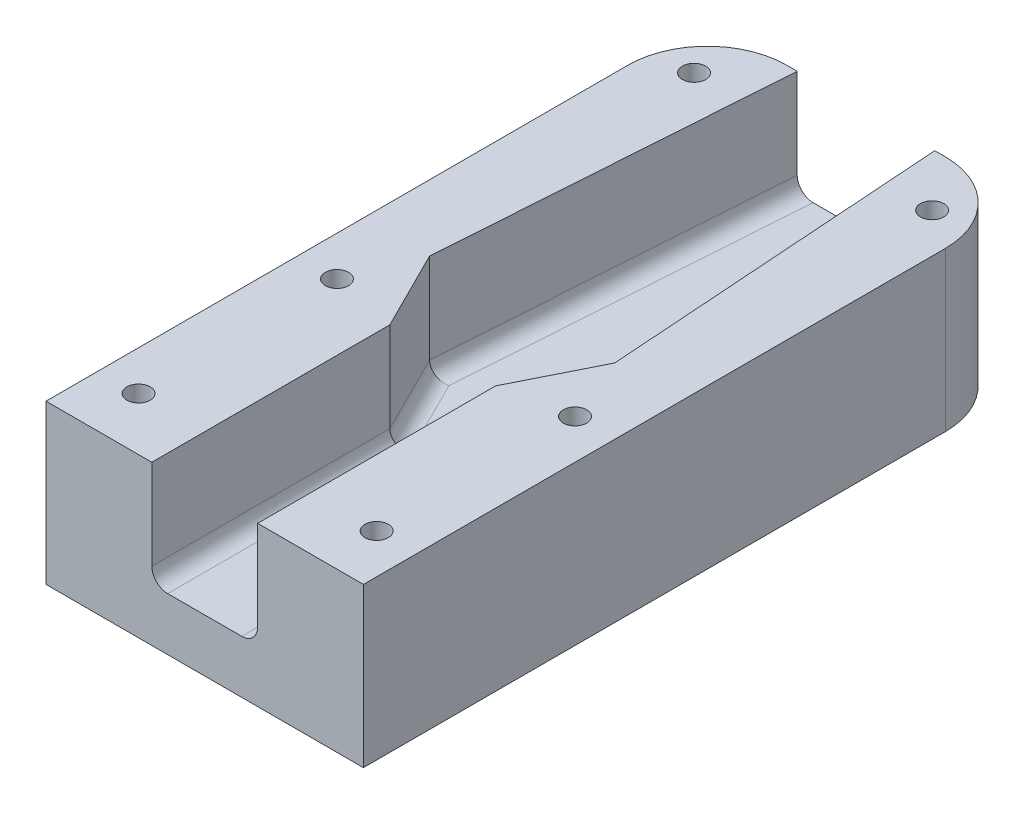
ISO-10303-21;
HEADER;
FILE_DESCRIPTION(('STEP AP214'),'2;1');
FILE_NAME('part.step','',(''),(''),'','','');
FILE_SCHEMA(('AUTOMOTIVE_DESIGN { 1 0 10303 214 1 1 1 1 }'));
ENDSEC;
DATA;
#1=APPLICATION_CONTEXT('core data for automotive mechanical design processes');
#2=APPLICATION_PROTOCOL_DEFINITION('international standard','automotive_design',2000,#1);
#3=PRODUCT_CONTEXT('',#1,'mechanical');
#4=PRODUCT('Part','Part','',(#3));
#5=PRODUCT_RELATED_PRODUCT_CATEGORY('part','',(#4));
#6=PRODUCT_DEFINITION_FORMATION('','',#4);
#7=PRODUCT_DEFINITION_CONTEXT('part definition',#1,'design');
#8=PRODUCT_DEFINITION('design','',#6,#7);
#9=PRODUCT_DEFINITION_SHAPE('','',#8);
#10=(LENGTH_UNIT() NAMED_UNIT(*) SI_UNIT(.MILLI.,.METRE.));
#11=(NAMED_UNIT(*) PLANE_ANGLE_UNIT() SI_UNIT($,.RADIAN.));
#12=(NAMED_UNIT(*) SI_UNIT($,.STERADIAN.) SOLID_ANGLE_UNIT());
#13=UNCERTAINTY_MEASURE_WITH_UNIT(LENGTH_MEASURE(1.E-05),#10,'distance_accuracy_value','');
#14=(GEOMETRIC_REPRESENTATION_CONTEXT(3) GLOBAL_UNCERTAINTY_ASSIGNED_CONTEXT((#13)) GLOBAL_UNIT_ASSIGNED_CONTEXT((#10,
#11,#12)) REPRESENTATION_CONTEXT('',''));
#15=CARTESIAN_POINT('',(0.,0.,0.));
#16=DIRECTION('',(0.,0.,1.));
#17=DIRECTION('',(1.,0.,0.));
#18=AXIS2_PLACEMENT_3D('',#15,#16,#17);
#19=CARTESIAN_POINT('',(-22.5000000000007,0.,52.5000000000062));
#20=DIRECTION('',(0.,1.,0.));
#21=DIRECTION('',(0.,0.,1.));
#22=AXIS2_PLACEMENT_3D('',#19,#20,#21);
#23=CYLINDRICAL_SURFACE('',#22,2.2);
#24=CARTESIAN_POINT('',(-22.5000000000007,30.0000000000002,52.5000000000062));
#25=DIRECTION('',(0.,1.,0.));
#26=DIRECTION('',(0.,0.,1.00000000000006));
#27=AXIS2_PLACEMENT_3D('',#24,#25,#26);
#28=CIRCLE('',#27,2.2);
#29=CARTESIAN_POINT('',(-22.5000000000007,30.0000000000002,54.7000000000063));
#30=VERTEX_POINT('',#29);
#31=EDGE_CURVE('E231',#30,#30,#28,.T.);
#32=ORIENTED_EDGE('',*,*,#31,.T.);
#33=EDGE_LOOP('',(#32));
#34=FACE_BOUND('',#33,.T.);
#35=CARTESIAN_POINT('',(-22.5000000000007,20.,52.5000000000062));
#36=DIRECTION('',(0.,-1.,0.));
#37=DIRECTION('',(0.,0.,-1.));
#38=AXIS2_PLACEMENT_3D('',#35,#36,#37);
#39=CIRCLE('',#38,2.2);
#40=CARTESIAN_POINT('',(-22.5000000000007,20.,50.3000000000062));
#41=VERTEX_POINT('',#40);
#42=EDGE_CURVE('E40',#41,#41,#39,.F.);
#43=ORIENTED_EDGE('',*,*,#42,.F.);
#44=EDGE_LOOP('',(#43));
#45=FACE_BOUND('',#44,.T.);
#46=ADVANCED_FACE('F36',(#34,#45),#23,.F.);
#47=CARTESIAN_POINT('',(22.5,-3.05311331771918E-13,-52.4999999999999));
#48=DIRECTION('',(0.,1.,0.));
#49=DIRECTION('',(0.,0.,1.));
#50=AXIS2_PLACEMENT_3D('',#47,#48,#49);
#51=CYLINDRICAL_SURFACE('',#50,2.2);
#52=CARTESIAN_POINT('',(22.5,29.9999999999999,-52.4999999999999));
#53=DIRECTION('',(0.,1.00000000000002,1.04111164134224E-13));
#54=DIRECTION('',(0.,1.03445030319449E-13,1.00000000000043));
#55=AXIS2_PLACEMENT_3D('',#52,#53,#54);
#56=CIRCLE('',#55,2.2);
#57=CARTESIAN_POINT('',(22.4999999999999,30.0000000000001,-50.299999999999));
#58=VERTEX_POINT('',#57);
#59=EDGE_CURVE('E222',#58,#58,#56,.T.);
#60=ORIENTED_EDGE('',*,*,#59,.T.);
#61=EDGE_LOOP('',(#60));
#62=FACE_BOUND('',#61,.T.);
#63=CARTESIAN_POINT('',(22.5,20.,-52.4999999999999));
#64=DIRECTION('',(0.,-1.,0.));
#65=DIRECTION('',(0.,0.,-1.));
#66=AXIS2_PLACEMENT_3D('',#63,#64,#65);
#67=CIRCLE('',#66,2.2);
#68=CARTESIAN_POINT('',(22.5,20.,-54.6999999999999));
#69=VERTEX_POINT('',#68);
#70=EDGE_CURVE('E327',#69,#69,#67,.F.);
#71=ORIENTED_EDGE('',*,*,#70,.F.);
#72=EDGE_LOOP('',(#71));
#73=FACE_BOUND('',#72,.T.);
#74=ADVANCED_FACE('F337',(#62,#73),#51,.F.);
#75=CARTESIAN_POINT('',(-22.5,-1.94289029309402E-13,-52.5));
#76=DIRECTION('',(0.,1.,0.));
#77=DIRECTION('',(0.,0.,1.));
#78=AXIS2_PLACEMENT_3D('',#75,#76,#77);
#79=CYLINDRICAL_SURFACE('',#78,2.2);
#80=CARTESIAN_POINT('',(-22.5,30.,-52.5));
#81=DIRECTION('',(0.,1.00000000000001,0.));
#82=DIRECTION('',(0.,0.,1.00000000000028));
#83=AXIS2_PLACEMENT_3D('',#80,#81,#82);
#84=CIRCLE('',#83,2.2);
#85=CARTESIAN_POINT('',(-22.5000000000001,30.0000000000001,-50.2999999999994));
#86=VERTEX_POINT('',#85);
#87=EDGE_CURVE('E227',#86,#86,#84,.T.);
#88=ORIENTED_EDGE('',*,*,#87,.T.);
#89=EDGE_LOOP('',(#88));
#90=FACE_BOUND('',#89,.T.);
#91=CARTESIAN_POINT('',(-22.5,20.,-52.5));
#92=DIRECTION('',(0.,-1.,0.));
#93=DIRECTION('',(0.,0.,-1.));
#94=AXIS2_PLACEMENT_3D('',#91,#92,#93);
#95=CIRCLE('',#94,2.2);
#96=CARTESIAN_POINT('',(-22.5,20.,-54.7));
#97=VERTEX_POINT('',#96);
#98=EDGE_CURVE('E325',#97,#97,#95,.F.);
#99=ORIENTED_EDGE('',*,*,#98,.F.);
#100=EDGE_LOOP('',(#99));
#101=FACE_BOUND('',#100,.T.);
#102=ADVANCED_FACE('F343',(#90,#101),#79,.F.);
#103=CARTESIAN_POINT('',(22.4999999999998,-2.4980018054066E-13,52.5000000000009));
#104=DIRECTION('',(0.,1.,0.));
#105=DIRECTION('',(0.,0.,1.));
#106=AXIS2_PLACEMENT_3D('',#103,#104,#105);
#107=CYLINDRICAL_SURFACE('',#106,2.2);
#108=CARTESIAN_POINT('',(22.4999999999998,29.9999999999999,52.5000000000009));
#109=DIRECTION('',(0.,1.00000000000001,0.));
#110=DIRECTION('',(0.,0.,1.00000000000016));
#111=AXIS2_PLACEMENT_3D('',#108,#109,#110);
#112=CIRCLE('',#111,2.2);
#113=CARTESIAN_POINT('',(22.4999999999998,30.,54.7000000000012));
#114=VERTEX_POINT('',#113);
#115=EDGE_CURVE('E228',#114,#114,#112,.T.);
#116=ORIENTED_EDGE('',*,*,#115,.T.);
#117=EDGE_LOOP('',(#116));
#118=FACE_BOUND('',#117,.T.);
#119=CARTESIAN_POINT('',(22.4999999999998,20.,52.5000000000009));
#120=DIRECTION('',(0.,-1.,0.));
#121=DIRECTION('',(0.,0.,-1.));
#122=AXIS2_PLACEMENT_3D('',#119,#120,#121);
#123=CIRCLE('',#122,2.2);
#124=CARTESIAN_POINT('',(22.4999999999998,20.,50.3000000000009));
#125=VERTEX_POINT('',#124);
#126=EDGE_CURVE('E322',#125,#125,#123,.F.);
#127=ORIENTED_EDGE('',*,*,#126,.F.);
#128=EDGE_LOOP('',(#127));
#129=FACE_BOUND('',#128,.T.);
#130=ADVANCED_FACE('F521',(#118,#129),#107,.F.);
#131=CARTESIAN_POINT('',(-22.5,30.0000000000002,15.0000000000009));
#132=DIRECTION('',(0.,-1.,0.));
#133=DIRECTION('',(0.,0.,-1.));
#134=AXIS2_PLACEMENT_3D('',#131,#132,#133);
#135=CYLINDRICAL_SURFACE('',#134,2.2);
#136=CARTESIAN_POINT('',(-22.5,30.0000000000002,15.0000000000009));
#137=DIRECTION('',(0.,-1.00000000000001,0.));
#138=DIRECTION('',(0.,0.,-1.00000000000022));
#139=AXIS2_PLACEMENT_3D('',#136,#137,#138);
#140=CIRCLE('',#139,2.2);
#141=CARTESIAN_POINT('',(-22.5,30.0000000000001,12.8000000000004));
#142=VERTEX_POINT('',#141);
#143=EDGE_CURVE('E207',#142,#142,#140,.T.);
#144=ORIENTED_EDGE('',*,*,#143,.F.);
#145=EDGE_LOOP('',(#144));
#146=FACE_BOUND('',#145,.T.);
#147=CARTESIAN_POINT('',(-22.5,20.,15.0000000000009));
#148=DIRECTION('',(0.,-1.,0.));
#149=DIRECTION('',(0.,0.,-1.));
#150=AXIS2_PLACEMENT_3D('',#147,#148,#149);
#151=CIRCLE('',#150,2.2);
#152=CARTESIAN_POINT('',(-22.5,20.,12.8000000000009));
#153=VERTEX_POINT('',#152);
#154=EDGE_CURVE('E318',#153,#153,#151,.F.);
#155=ORIENTED_EDGE('',*,*,#154,.F.);
#156=EDGE_LOOP('',(#155));
#157=FACE_BOUND('',#156,.T.);
#158=ADVANCED_FACE('F518',(#146,#157),#135,.F.);
#159=CARTESIAN_POINT('',(22.5,30.0000000000002,15.0000000000009));
#160=DIRECTION('',(0.,-1.,0.));
#161=DIRECTION('',(0.,0.,-1.));
#162=AXIS2_PLACEMENT_3D('',#159,#160,#161);
#163=CYLINDRICAL_SURFACE('',#162,2.2);
#164=CARTESIAN_POINT('',(22.5,30.0000000000002,15.0000000000009));
#165=DIRECTION('',(0.,-1.,0.));
#166=DIRECTION('',(0.,0.,-1.00000000000002));
#167=AXIS2_PLACEMENT_3D('',#164,#165,#166);
#168=CIRCLE('',#167,2.2);
#169=CARTESIAN_POINT('',(22.5,30.0000000000002,12.8000000000009));
#170=VERTEX_POINT('',#169);
#171=EDGE_CURVE('E219',#170,#170,#168,.T.);
#172=ORIENTED_EDGE('',*,*,#171,.F.);
#173=EDGE_LOOP('',(#172));
#174=FACE_BOUND('',#173,.T.);
#175=CARTESIAN_POINT('',(22.5,20.,15.0000000000009));
#176=DIRECTION('',(0.,-1.,0.));
#177=DIRECTION('',(0.,0.,-1.));
#178=AXIS2_PLACEMENT_3D('',#175,#176,#177);
#179=CIRCLE('',#178,2.2);
#180=CARTESIAN_POINT('',(22.5,20.,12.8000000000009));
#181=VERTEX_POINT('',#180);
#182=EDGE_CURVE('E315',#181,#181,#179,.F.);
#183=ORIENTED_EDGE('',*,*,#182,.F.);
#184=EDGE_LOOP('',(#183));
#185=FACE_BOUND('',#184,.T.);
#186=ADVANCED_FACE('F370',(#174,#185),#163,.F.);
#187=CARTESIAN_POINT('',(-30.,30.,-62.5));
#188=DIRECTION('',(0.,0.,1.));
#189=DIRECTION('',(1.,0.,0.));
#190=AXIS2_PLACEMENT_3D('',#187,#188,#189);
#191=PLANE('',#190);
#192=DIRECTION('',(-1.,0.,0.));
#193=VECTOR('',#192,1.);
#194=CARTESIAN_POINT('',(-30.,0.,-62.5));
#195=LINE('',#194,#193);
#196=CARTESIAN_POINT('',(15.,0.,-62.5));
#197=VERTEX_POINT('',#196);
#198=CARTESIAN_POINT('',(-15.,0.,-62.5));
#199=VERTEX_POINT('',#198);
#200=EDGE_CURVE('E250',#197,#199,#195,.T.);
#201=ORIENTED_EDGE('',*,*,#200,.T.);
#202=DIRECTION('',(0.,-1.,0.));
#203=VECTOR('',#202,1.);
#204=CARTESIAN_POINT('',(-15.,30.,-62.5));
#205=LINE('',#204,#203);
#206=CARTESIAN_POINT('',(-15.,30.,-62.5));
#207=VERTEX_POINT('',#206);
#208=EDGE_CURVE('E60',#199,#207,#205,.F.);
#209=ORIENTED_EDGE('',*,*,#208,.T.);
#210=DIRECTION('',(-1.,0.,0.));
#211=VECTOR('',#210,1.);
#212=CARTESIAN_POINT('',(-30.,30.,-62.5));
#213=LINE('',#212,#211);
#214=CARTESIAN_POINT('',(-12.9999999999998,30.,-62.5));
#215=VERTEX_POINT('',#214);
#216=EDGE_CURVE('E239',#215,#207,#213,.T.);
#217=ORIENTED_EDGE('',*,*,#216,.F.);
#218=DIRECTION('',(0.,1.,0.));
#219=VECTOR('',#218,1.);
#220=CARTESIAN_POINT('',(-13.,9.99999999999994,-62.4999999999999));
#221=LINE('',#220,#219);
#222=CARTESIAN_POINT('',(-13.,13.0000000000001,-62.4999999999999));
#223=VERTEX_POINT('',#222);
#224=EDGE_CURVE('E177',#223,#215,#221,.T.);
#225=ORIENTED_EDGE('',*,*,#224,.F.);
#226=CARTESIAN_POINT('',(-9.99281924476169,13.0000000000001,-62.5));
#227=DIRECTION('',(0.,0.,1.));
#228=DIRECTION('',(-1.,0.,0.));
#229=AXIS2_PLACEMENT_3D('',#226,#227,#228);
#230=ELLIPSE('',#229,3.00718075523813,3.);
#231=CARTESIAN_POINT('',(-9.99281924476168,9.99999999999991,-62.4999999999997));
#232=VERTEX_POINT('',#231);
#233=EDGE_CURVE('E290',#223,#232,#230,.T.);
#234=ORIENTED_EDGE('',*,*,#233,.T.);
#235=DIRECTION('',(-0.999999999999998,0.,0.));
#236=VECTOR('',#235,1.);
#237=CARTESIAN_POINT('',(0.,9.99999999999994,-62.4999999999998));
#238=LINE('',#237,#236);
#239=CARTESIAN_POINT('',(9.99281924476263,9.99999999999998,-62.4999999999999));
#240=VERTEX_POINT('',#239);
#241=EDGE_CURVE('E203',#240,#232,#238,.T.);
#242=ORIENTED_EDGE('',*,*,#241,.F.);
#243=CARTESIAN_POINT('',(9.99281924476265,13.0000000000001,-62.5));
#244=DIRECTION('',(0.,0.,1.));
#245=DIRECTION('',(-1.,0.,0.));
#246=AXIS2_PLACEMENT_3D('',#243,#244,#245);
#247=ELLIPSE('',#246,3.00718075523813,3.);
#248=CARTESIAN_POINT('',(13.,13.0000000000001,-62.5));
#249=VERTEX_POINT('',#248);
#250=EDGE_CURVE('E284',#240,#249,#247,.T.);
#251=ORIENTED_EDGE('',*,*,#250,.T.);
#252=DIRECTION('',(0.,1.,0.));
#253=VECTOR('',#252,1.);
#254=CARTESIAN_POINT('',(13.,9.99999999999994,-62.5));
#255=LINE('',#254,#253);
#256=CARTESIAN_POINT('',(13.,29.9999999999999,-62.5));
#257=VERTEX_POINT('',#256);
#258=EDGE_CURVE('E204',#249,#257,#255,.T.);
#259=ORIENTED_EDGE('',*,*,#258,.T.);
#260=CARTESIAN_POINT('',(15.,30.,-62.5));
#261=VERTEX_POINT('',#260);
#262=EDGE_CURVE('E241',#261,#257,#213,.T.);
#263=ORIENTED_EDGE('',*,*,#262,.F.);
#264=DIRECTION('',(0.,-1.,0.));
#265=VECTOR('',#264,1.);
#266=CARTESIAN_POINT('',(15.,30.,-62.5));
#267=LINE('',#266,#265);
#268=EDGE_CURVE('E308',#261,#197,#267,.T.);
#269=ORIENTED_EDGE('',*,*,#268,.T.);
#270=EDGE_LOOP('',(#201,#209,#217,#225,#234,#242,#251,#259,#263,#269));
#271=FACE_BOUND('',#270,.T.);
#272=ADVANCED_FACE('F352',(#271),#191,.F.);
#273=CARTESIAN_POINT('',(0.,30.,0.));
#274=DIRECTION('',(0.,1.,0.));
#275=DIRECTION('',(0.,0.,1.));
#276=AXIS2_PLACEMENT_3D('',#273,#274,#275);
#277=PLANE('',#276);
#278=ORIENTED_EDGE('',*,*,#171,.T.);
#279=EDGE_LOOP('',(#278));
#280=FACE_BOUND('',#279,.T.);
#281=ORIENTED_EDGE('',*,*,#115,.F.);
#282=EDGE_LOOP('',(#281));
#283=FACE_BOUND('',#282,.T.);
#284=ORIENTED_EDGE('',*,*,#59,.F.);
#285=EDGE_LOOP('',(#284));
#286=FACE_BOUND('',#285,.T.);
#287=DIRECTION('',(0.,0.,-1.));
#288=VECTOR('',#287,1.);
#289=CARTESIAN_POINT('',(30.,30.,-62.5));
#290=LINE('',#289,#288);
#291=CARTESIAN_POINT('',(30.,30.,62.5));
#292=VERTEX_POINT('',#291);
#293=CARTESIAN_POINT('',(30.,30.,-47.5));
#294=VERTEX_POINT('',#293);
#295=EDGE_CURVE('E237',#292,#294,#290,.T.);
#296=ORIENTED_EDGE('',*,*,#295,.T.);
#297=CARTESIAN_POINT('',(15.,30.,-47.5));
#298=DIRECTION('',(0.,1.,0.));
#299=DIRECTION('',(0.,0.,1.));
#300=AXIS2_PLACEMENT_3D('',#297,#298,#299);
#301=CIRCLE('',#300,15.);
#302=EDGE_CURVE('E11',#294,#261,#301,.T.);
#303=ORIENTED_EDGE('',*,*,#302,.T.);
#304=ORIENTED_EDGE('',*,*,#262,.T.);
#305=DIRECTION('',(0.0690654551877237,0.,0.997612130489518));
#306=VECTOR('',#305,1.);
#307=CARTESIAN_POINT('',(17.2442730110123,29.9999999999999,-1.19383428537767));
#308=LINE('',#307,#306);
#309=CARTESIAN_POINT('',(17.5,30.,2.50000000000028));
#310=VERTEX_POINT('',#309);
#311=EDGE_CURVE('E200',#257,#310,#308,.T.);
#312=ORIENTED_EDGE('',*,*,#311,.T.);
#313=DIRECTION('',(-0.447213595499959,0.,0.89442719099992));
#314=VECTOR('',#313,1.);
#315=CARTESIAN_POINT('',(15.,30.,7.50000000000006));
#316=LINE('',#315,#314);
#317=CARTESIAN_POINT('',(9.99999999999996,30.,17.500000000001));
#318=VERTEX_POINT('',#317);
#319=EDGE_CURVE('E197',#310,#318,#316,.T.);
#320=ORIENTED_EDGE('',*,*,#319,.T.);
#321=DIRECTION('',(0.,0.,-1.));
#322=VECTOR('',#321,1.);
#323=CARTESIAN_POINT('',(9.99999999999994,29.9999999999999,9.99200722162641E-13));
#324=LINE('',#323,#322);
#325=CARTESIAN_POINT('',(9.99999999999982,30.,62.500000000001));
#326=VERTEX_POINT('',#325);
#327=EDGE_CURVE('E191',#326,#318,#324,.T.);
#328=ORIENTED_EDGE('',*,*,#327,.F.);
#329=DIRECTION('',(1.,0.,0.));
#330=VECTOR('',#329,1.);
#331=CARTESIAN_POINT('',(-30.,30.,62.5));
#332=LINE('',#331,#330);
#333=EDGE_CURVE('E245',#326,#292,#332,.T.);
#334=ORIENTED_EDGE('',*,*,#333,.T.);
#335=EDGE_LOOP('',(#296,#303,#304,#312,#320,#328,#334));
#336=FACE_BOUND('',#335,.T.);
#337=ADVANCED_FACE('F349',(#280,#283,#286,#336),#277,.T.);
#338=ORIENTED_EDGE('',*,*,#31,.F.);
#339=EDGE_LOOP('',(#338));
#340=FACE_BOUND('',#339,.T.);
#341=ORIENTED_EDGE('',*,*,#87,.F.);
#342=EDGE_LOOP('',(#341));
#343=FACE_BOUND('',#342,.T.);
#344=ORIENTED_EDGE('',*,*,#143,.T.);
#345=EDGE_LOOP('',(#344));
#346=FACE_BOUND('',#345,.T.);
#347=ORIENTED_EDGE('',*,*,#216,.T.);
#348=CARTESIAN_POINT('',(-15.,30.,-47.5));
#349=DIRECTION('',(0.,1.,0.));
#350=DIRECTION('',(0.,0.,1.));
#351=AXIS2_PLACEMENT_3D('',#348,#349,#350);
#352=CIRCLE('',#351,15.);
#353=CARTESIAN_POINT('',(-30.,30.,-47.5));
#354=VERTEX_POINT('',#353);
#355=EDGE_CURVE('E312',#207,#354,#352,.T.);
#356=ORIENTED_EDGE('',*,*,#355,.T.);
#357=DIRECTION('',(0.,0.,1.));
#358=VECTOR('',#357,1.);
#359=CARTESIAN_POINT('',(-30.,30.,-62.5));
#360=LINE('',#359,#358);
#361=CARTESIAN_POINT('',(-30.,30.,62.5));
#362=VERTEX_POINT('',#361);
#363=EDGE_CURVE('E243',#354,#362,#360,.T.);
#364=ORIENTED_EDGE('',*,*,#363,.T.);
#365=CARTESIAN_POINT('',(-10.,30.,62.5000000000001));
#366=VERTEX_POINT('',#365);
#367=EDGE_CURVE('E246',#362,#366,#332,.T.);
#368=ORIENTED_EDGE('',*,*,#367,.T.);
#369=DIRECTION('',(0.,0.,-1.));
#370=VECTOR('',#369,1.);
#371=CARTESIAN_POINT('',(-10.,30.,1.11022302462516E-13));
#372=LINE('',#371,#370);
#373=CARTESIAN_POINT('',(-10.,30.,17.5000000000001));
#374=VERTEX_POINT('',#373);
#375=EDGE_CURVE('E189',#366,#374,#372,.T.);
#376=ORIENTED_EDGE('',*,*,#375,.T.);
#377=DIRECTION('',(-0.447213595499958,0.,-0.894427190999916));
#378=VECTOR('',#377,1.);
#379=CARTESIAN_POINT('',(-15.,30.,7.50000000000006));
#380=LINE('',#379,#378);
#381=CARTESIAN_POINT('',(-17.5,30.,2.50000000000039));
#382=VERTEX_POINT('',#381);
#383=EDGE_CURVE('E171',#374,#382,#380,.T.);
#384=ORIENTED_EDGE('',*,*,#383,.T.);
#385=DIRECTION('',(-0.0690654551877378,0.,0.997612130489507));
#386=VECTOR('',#385,1.);
#387=CARTESIAN_POINT('',(-17.2442730110123,30.,-1.19383428537778));
#388=LINE('',#387,#386);
#389=EDGE_CURVE('E180',#215,#382,#388,.T.);
#390=ORIENTED_EDGE('',*,*,#389,.F.);
#391=EDGE_LOOP('',(#347,#356,#364,#368,#376,#384,#390));
#392=FACE_BOUND('',#391,.T.);
#393=ADVANCED_FACE('F186',(#340,#343,#346,#392),#277,.T.);
#394=CARTESIAN_POINT('',(30.,30.,-62.5));
#395=DIRECTION('',(-1.,0.,0.));
#396=DIRECTION('',(0.,0.,1.));
#397=AXIS2_PLACEMENT_3D('',#394,#395,#396);
#398=PLANE('',#397);
#399=DIRECTION('',(0.,0.,-1.));
#400=VECTOR('',#399,1.);
#401=CARTESIAN_POINT('',(30.,0.,-62.5));
#402=LINE('',#401,#400);
#403=CARTESIAN_POINT('',(30.,0.,62.5));
#404=VERTEX_POINT('',#403);
#405=CARTESIAN_POINT('',(30.,0.,-47.5));
#406=VERTEX_POINT('',#405);
#407=EDGE_CURVE('E236',#404,#406,#402,.T.);
#408=ORIENTED_EDGE('',*,*,#407,.T.);
#409=DIRECTION('',(0.,-1.,0.));
#410=VECTOR('',#409,1.);
#411=CARTESIAN_POINT('',(30.,30.,-47.5));
#412=LINE('',#411,#410);
#413=EDGE_CURVE('E45',#406,#294,#412,.F.);
#414=ORIENTED_EDGE('',*,*,#413,.T.);
#415=ORIENTED_EDGE('',*,*,#295,.F.);
#416=DIRECTION('',(0.,-1.,0.));
#417=VECTOR('',#416,1.);
#418=CARTESIAN_POINT('',(30.,30.,62.5));
#419=LINE('',#418,#417);
#420=EDGE_CURVE('E248',#292,#404,#419,.T.);
#421=ORIENTED_EDGE('',*,*,#420,.T.);
#422=EDGE_LOOP('',(#408,#414,#415,#421));
#423=FACE_BOUND('',#422,.T.);
#424=ADVANCED_FACE('F366',(#423),#398,.F.);
#425=CARTESIAN_POINT('',(-30.,30.,-62.5));
#426=DIRECTION('',(1.,0.,0.));
#427=DIRECTION('',(0.,0.,-1.));
#428=AXIS2_PLACEMENT_3D('',#425,#426,#427);
#429=PLANE('',#428);
#430=ORIENTED_EDGE('',*,*,#363,.F.);
#431=DIRECTION('',(0.,-1.,0.));
#432=VECTOR('',#431,1.);
#433=CARTESIAN_POINT('',(-30.,30.,-47.5));
#434=LINE('',#433,#432);
#435=CARTESIAN_POINT('',(-30.,0.,-47.5));
#436=VERTEX_POINT('',#435);
#437=EDGE_CURVE('E292',#354,#436,#434,.T.);
#438=ORIENTED_EDGE('',*,*,#437,.T.);
#439=DIRECTION('',(0.,0.,1.));
#440=VECTOR('',#439,1.);
#441=CARTESIAN_POINT('',(-30.,0.,-62.5));
#442=LINE('',#441,#440);
#443=CARTESIAN_POINT('',(-30.,0.,62.5));
#444=VERTEX_POINT('',#443);
#445=EDGE_CURVE('E252',#436,#444,#442,.T.);
#446=ORIENTED_EDGE('',*,*,#445,.T.);
#447=DIRECTION('',(0.,-1.,0.));
#448=VECTOR('',#447,1.);
#449=CARTESIAN_POINT('',(-30.,30.,62.5));
#450=LINE('',#449,#448);
#451=EDGE_CURVE('E257',#362,#444,#450,.T.);
#452=ORIENTED_EDGE('',*,*,#451,.F.);
#453=EDGE_LOOP('',(#430,#438,#446,#452));
#454=FACE_BOUND('',#453,.T.);
#455=ADVANCED_FACE('F362',(#454),#429,.F.);
#456=CARTESIAN_POINT('',(-30.,30.,62.5));
#457=DIRECTION('',(0.,0.,-1.));
#458=DIRECTION('',(-1.,0.,0.));
#459=AXIS2_PLACEMENT_3D('',#456,#457,#458);
#460=PLANE('',#459);
#461=ORIENTED_EDGE('',*,*,#333,.F.);
#462=DIRECTION('',(0.,1.,0.));
#463=VECTOR('',#462,1.);
#464=CARTESIAN_POINT('',(9.99999999999982,10.,62.500000000001));
#465=LINE('',#464,#463);
#466=CARTESIAN_POINT('',(9.99999999999982,12.9999999999999,62.500000000001));
#467=VERTEX_POINT('',#466);
#468=EDGE_CURVE('E212',#467,#326,#465,.T.);
#469=ORIENTED_EDGE('',*,*,#468,.F.);
#470=CARTESIAN_POINT('',(6.9999999999999,12.9999999999999,62.5));
#471=DIRECTION('',(0.,0.,-1.));
#472=DIRECTION('',(-1.,0.,0.));
#473=AXIS2_PLACEMENT_3D('',#470,#471,#472);
#474=CIRCLE('',#473,3.);
#475=CARTESIAN_POINT('',(6.9999999999999,10.0000000000002,62.5000000000016));
#476=VERTEX_POINT('',#475);
#477=EDGE_CURVE('E286',#467,#476,#474,.T.);
#478=ORIENTED_EDGE('',*,*,#477,.T.);
#479=DIRECTION('',(1.,0.,0.));
#480=VECTOR('',#479,1.);
#481=CARTESIAN_POINT('',(-2.42861286636753E-13,10.0000000000002,62.5000000000016));
#482=LINE('',#481,#480);
#483=CARTESIAN_POINT('',(-7.00000000000002,10.0000000000002,62.5000000000016));
#484=VERTEX_POINT('',#483);
#485=EDGE_CURVE('E218',#484,#476,#482,.T.);
#486=ORIENTED_EDGE('',*,*,#485,.F.);
#487=CARTESIAN_POINT('',(-7.00000000000002,12.9999999999999,62.5));
#488=DIRECTION('',(0.,0.,-1.));
#489=DIRECTION('',(-1.,0.,0.));
#490=AXIS2_PLACEMENT_3D('',#487,#488,#489);
#491=CIRCLE('',#490,3.);
#492=CARTESIAN_POINT('',(-10.,12.9999999999999,62.5000000000001));
#493=VERTEX_POINT('',#492);
#494=EDGE_CURVE('E288',#484,#493,#491,.T.);
#495=ORIENTED_EDGE('',*,*,#494,.T.);
#496=DIRECTION('',(0.,1.,0.));
#497=VECTOR('',#496,1.);
#498=CARTESIAN_POINT('',(-10.,10.,62.5000000000001));
#499=LINE('',#498,#497);
#500=EDGE_CURVE('E214',#493,#366,#499,.T.);
#501=ORIENTED_EDGE('',*,*,#500,.T.);
#502=ORIENTED_EDGE('',*,*,#367,.F.);
#503=ORIENTED_EDGE('',*,*,#451,.T.);
#504=DIRECTION('',(1.,0.,0.));
#505=VECTOR('',#504,1.);
#506=CARTESIAN_POINT('',(-30.,0.,62.5));
#507=LINE('',#506,#505);
#508=EDGE_CURVE('E240',#444,#404,#507,.T.);
#509=ORIENTED_EDGE('',*,*,#508,.T.);
#510=ORIENTED_EDGE('',*,*,#420,.F.);
#511=EDGE_LOOP('',(#461,#469,#478,#486,#495,#501,#502,#503,#509,#510));
#512=FACE_BOUND('',#511,.T.);
#513=ADVANCED_FACE('F358',(#512),#460,.F.);
#514=CARTESIAN_POINT('',(0.,0.,0.));
#515=DIRECTION('',(0.,1.,0.));
#516=DIRECTION('',(0.,0.,1.));
#517=AXIS2_PLACEMENT_3D('',#514,#515,#516);
#518=PLANE('',#517);
#519=CARTESIAN_POINT('',(-22.5000000000007,0.,52.5000000000062));
#520=DIRECTION('',(0.,-1.,0.));
#521=DIRECTION('',(0.,0.,-1.));
#522=AXIS2_PLACEMENT_3D('',#519,#520,#521);
#523=CIRCLE('',#522,3.75);
#524=CARTESIAN_POINT('',(-22.5000000000007,0.,48.7500000000062));
#525=VERTEX_POINT('',#524);
#526=EDGE_CURVE('E455',#525,#525,#523,.T.);
#527=ORIENTED_EDGE('',*,*,#526,.F.);
#528=EDGE_LOOP('',(#527));
#529=FACE_BOUND('',#528,.T.);
#530=CARTESIAN_POINT('',(22.5,0.,15.0000000000009));
#531=DIRECTION('',(0.,-1.,0.));
#532=DIRECTION('',(0.,0.,-1.));
#533=AXIS2_PLACEMENT_3D('',#530,#531,#532);
#534=CIRCLE('',#533,3.75);
#535=CARTESIAN_POINT('',(22.5,0.,11.2500000000009));
#536=VERTEX_POINT('',#535);
#537=EDGE_CURVE('E444',#536,#536,#534,.T.);
#538=ORIENTED_EDGE('',*,*,#537,.F.);
#539=EDGE_LOOP('',(#538));
#540=FACE_BOUND('',#539,.T.);
#541=CARTESIAN_POINT('',(22.5,0.,-52.4999999999999));
#542=DIRECTION('',(0.,-1.,0.));
#543=DIRECTION('',(0.,0.,-1.));
#544=AXIS2_PLACEMENT_3D('',#541,#542,#543);
#545=CIRCLE('',#544,3.75);
#546=CARTESIAN_POINT('',(22.5,0.,-56.2499999999999));
#547=VERTEX_POINT('',#546);
#548=EDGE_CURVE('E443',#547,#547,#545,.T.);
#549=ORIENTED_EDGE('',*,*,#548,.F.);
#550=EDGE_LOOP('',(#549));
#551=FACE_BOUND('',#550,.T.);
#552=CARTESIAN_POINT('',(-22.5,0.,15.0000000000009));
#553=DIRECTION('',(0.,-1.,0.));
#554=DIRECTION('',(0.,0.,-1.));
#555=AXIS2_PLACEMENT_3D('',#552,#553,#554);
#556=CIRCLE('',#555,3.75);
#557=CARTESIAN_POINT('',(-22.5,0.,11.2500000000009));
#558=VERTEX_POINT('',#557);
#559=EDGE_CURVE('E437',#558,#558,#556,.T.);
#560=ORIENTED_EDGE('',*,*,#559,.F.);
#561=EDGE_LOOP('',(#560));
#562=FACE_BOUND('',#561,.T.);
#563=CARTESIAN_POINT('',(22.4999999999998,0.,52.5000000000009));
#564=DIRECTION('',(0.,-1.,0.));
#565=DIRECTION('',(0.,0.,-1.));
#566=AXIS2_PLACEMENT_3D('',#563,#564,#565);
#567=CIRCLE('',#566,3.75);
#568=CARTESIAN_POINT('',(22.4999999999998,0.,48.7500000000009));
#569=VERTEX_POINT('',#568);
#570=EDGE_CURVE('E456',#569,#569,#567,.T.);
#571=ORIENTED_EDGE('',*,*,#570,.F.);
#572=EDGE_LOOP('',(#571));
#573=FACE_BOUND('',#572,.T.);
#574=CARTESIAN_POINT('',(-22.5,0.,-52.5));
#575=DIRECTION('',(0.,-1.,0.));
#576=DIRECTION('',(0.,0.,-1.));
#577=AXIS2_PLACEMENT_3D('',#574,#575,#576);
#578=CIRCLE('',#577,3.75);
#579=CARTESIAN_POINT('',(-22.5,0.,-56.25));
#580=VERTEX_POINT('',#579);
#581=EDGE_CURVE('E434',#580,#580,#578,.T.);
#582=ORIENTED_EDGE('',*,*,#581,.F.);
#583=EDGE_LOOP('',(#582));
#584=FACE_BOUND('',#583,.T.);
#585=ORIENTED_EDGE('',*,*,#445,.F.);
#586=CARTESIAN_POINT('',(-15.,0.,-47.5));
#587=DIRECTION('',(0.,1.,0.));
#588=DIRECTION('',(0.,0.,1.));
#589=AXIS2_PLACEMENT_3D('',#586,#587,#588);
#590=CIRCLE('',#589,15.);
#591=EDGE_CURVE('E306',#436,#199,#590,.F.);
#592=ORIENTED_EDGE('',*,*,#591,.T.);
#593=ORIENTED_EDGE('',*,*,#200,.F.);
#594=CARTESIAN_POINT('',(15.,0.,-47.5));
#595=DIRECTION('',(0.,1.,0.));
#596=DIRECTION('',(0.,0.,1.));
#597=AXIS2_PLACEMENT_3D('',#594,#595,#596);
#598=CIRCLE('',#597,15.);
#599=EDGE_CURVE('E304',#197,#406,#598,.F.);
#600=ORIENTED_EDGE('',*,*,#599,.T.);
#601=ORIENTED_EDGE('',*,*,#407,.F.);
#602=ORIENTED_EDGE('',*,*,#508,.F.);
#603=EDGE_LOOP('',(#585,#592,#593,#600,#601,#602));
#604=FACE_BOUND('',#603,.T.);
#605=ADVANCED_FACE('F354',(#529,#540,#551,#562,#573,#584,#604),#518,.F.);
#606=CARTESIAN_POINT('',(17.2442730110123,9.99999999999994,-1.19383428537767));
#607=DIRECTION('',(-0.997612130489457,0.,0.0690654551877194));
#608=DIRECTION('',(0.0690654551877194,0.,0.997612130489457));
#609=AXIS2_PLACEMENT_3D('',#606,#607,#608);
#610=PLANE('',#609);
#611=ORIENTED_EDGE('',*,*,#258,.F.);
#612=DIRECTION('',(0.0690654551877194,0.,0.997612130489457));
#613=VECTOR('',#612,1.);
#614=CARTESIAN_POINT('',(17.5,13.,2.50000000000028));
#615=LINE('',#614,#613);
#616=CARTESIAN_POINT('',(17.5,13.,2.50000000000028));
#617=VERTEX_POINT('',#616);
#618=EDGE_CURVE('E260',#249,#617,#615,.T.);
#619=ORIENTED_EDGE('',*,*,#618,.T.);
#620=DIRECTION('',(0.,1.,0.));
#621=VECTOR('',#620,1.);
#622=CARTESIAN_POINT('',(17.5,10.,2.50000000000028));
#623=LINE('',#622,#621);
#624=EDGE_CURVE('E208',#617,#310,#623,.T.);
#625=ORIENTED_EDGE('',*,*,#624,.T.);
#626=ORIENTED_EDGE('',*,*,#311,.F.);
#627=EDGE_LOOP('',(#611,#619,#625,#626));
#628=FACE_BOUND('',#627,.T.);
#629=ADVANCED_FACE('F357',(#628),#610,.T.);
#630=CARTESIAN_POINT('',(15.,10.,7.50000000000006));
#631=DIRECTION('',(-0.894427190999916,0.,-0.447213595499957));
#632=DIRECTION('',(-0.447213595499957,0.,0.894427190999916));
#633=AXIS2_PLACEMENT_3D('',#630,#631,#632);
#634=PLANE('',#633);
#635=ORIENTED_EDGE('',*,*,#624,.F.);
#636=DIRECTION('',(-0.447213595499957,0.,0.894427190999916));
#637=VECTOR('',#636,1.);
#638=CARTESIAN_POINT('',(9.99999999999963,13.,17.5000000000008));
#639=LINE('',#638,#637);
#640=CARTESIAN_POINT('',(9.99999999999996,13.,17.500000000001));
#641=VERTEX_POINT('',#640);
#642=EDGE_CURVE('E275',#617,#641,#639,.T.);
#643=ORIENTED_EDGE('',*,*,#642,.T.);
#644=DIRECTION('',(0.,1.,0.));
#645=VECTOR('',#644,1.);
#646=CARTESIAN_POINT('',(9.99999999999996,10.,17.500000000001));
#647=LINE('',#646,#645);
#648=EDGE_CURVE('E210',#641,#318,#647,.T.);
#649=ORIENTED_EDGE('',*,*,#648,.T.);
#650=ORIENTED_EDGE('',*,*,#319,.F.);
#651=EDGE_LOOP('',(#635,#643,#649,#650));
#652=FACE_BOUND('',#651,.T.);
#653=ADVANCED_FACE('F490',(#652),#634,.T.);
#654=CARTESIAN_POINT('',(9.99999999999994,9.99999999999994,9.99200722162641E-13));
#655=DIRECTION('',(1.,0.,0.));
#656=DIRECTION('',(0.,0.,-1.));
#657=AXIS2_PLACEMENT_3D('',#654,#655,#656);
#658=PLANE('',#657);
#659=ORIENTED_EDGE('',*,*,#648,.F.);
#660=DIRECTION('',(0.,0.,-1.));
#661=VECTOR('',#660,1.);
#662=CARTESIAN_POINT('',(9.99999999999994,13.,1.00294772487075E-12));
#663=LINE('',#662,#661);
#664=EDGE_CURVE('E277',#641,#467,#663,.F.);
#665=ORIENTED_EDGE('',*,*,#664,.T.);
#666=ORIENTED_EDGE('',*,*,#468,.T.);
#667=ORIENTED_EDGE('',*,*,#327,.T.);
#668=EDGE_LOOP('',(#659,#665,#666,#667));
#669=FACE_BOUND('',#668,.T.);
#670=ADVANCED_FACE('F495',(#669),#658,.F.);
#671=CARTESIAN_POINT('',(-10.,10.,1.11022302462516E-13));
#672=DIRECTION('',(1.,0.,0.));
#673=DIRECTION('',(0.,0.,-1.));
#674=AXIS2_PLACEMENT_3D('',#671,#672,#673);
#675=PLANE('',#674);
#676=ORIENTED_EDGE('',*,*,#500,.F.);
#677=DIRECTION('',(0.,0.,-1.));
#678=VECTOR('',#677,1.);
#679=CARTESIAN_POINT('',(-10.,13.,17.5000000000001));
#680=LINE('',#679,#678);
#681=CARTESIAN_POINT('',(-10.,13.,17.5000000000001));
#682=VERTEX_POINT('',#681);
#683=EDGE_CURVE('E280',#493,#682,#680,.T.);
#684=ORIENTED_EDGE('',*,*,#683,.T.);
#685=DIRECTION('',(0.,1.,0.));
#686=VECTOR('',#685,1.);
#687=CARTESIAN_POINT('',(-10.,10.,17.5000000000001));
#688=LINE('',#687,#686);
#689=EDGE_CURVE('E176',#682,#374,#688,.T.);
#690=ORIENTED_EDGE('',*,*,#689,.T.);
#691=ORIENTED_EDGE('',*,*,#375,.F.);
#692=EDGE_LOOP('',(#676,#684,#690,#691));
#693=FACE_BOUND('',#692,.T.);
#694=ADVANCED_FACE('F418',(#693),#675,.T.);
#695=CARTESIAN_POINT('',(-15.,10.,7.50000000000006));
#696=DIRECTION('',(0.894427190999916,0.,-0.447213595499958));
#697=DIRECTION('',(-0.447213595499958,0.,-0.894427190999916));
#698=AXIS2_PLACEMENT_3D('',#695,#696,#697);
#699=PLANE('',#698);
#700=ORIENTED_EDGE('',*,*,#689,.F.);
#701=DIRECTION('',(-0.447213595499958,0.,-0.894427190999916));
#702=VECTOR('',#701,1.);
#703=CARTESIAN_POINT('',(-17.4999999999999,13.,2.50000000000033));
#704=LINE('',#703,#702);
#705=CARTESIAN_POINT('',(-17.5,13.,2.50000000000039));
#706=VERTEX_POINT('',#705);
#707=EDGE_CURVE('E174',#682,#706,#704,.T.);
#708=ORIENTED_EDGE('',*,*,#707,.T.);
#709=DIRECTION('',(0.,1.,0.));
#710=VECTOR('',#709,1.);
#711=CARTESIAN_POINT('',(-17.5,9.99999999999997,2.50000000000039));
#712=LINE('',#711,#710);
#713=EDGE_CURVE('E166',#706,#382,#712,.T.);
#714=ORIENTED_EDGE('',*,*,#713,.T.);
#715=ORIENTED_EDGE('',*,*,#383,.F.);
#716=EDGE_LOOP('',(#700,#708,#714,#715));
#717=FACE_BOUND('',#716,.T.);
#718=ADVANCED_FACE('F169',(#717),#699,.T.);
#719=CARTESIAN_POINT('',(-17.2442730110123,10.,-1.19383428537778));
#720=DIRECTION('',(-0.997612130489456,0.,-0.0690654551877343));
#721=DIRECTION('',(-0.0690654551877343,0.,0.997612130489456));
#722=AXIS2_PLACEMENT_3D('',#719,#720,#721);
#723=PLANE('',#722);
#724=ORIENTED_EDGE('',*,*,#713,.F.);
#725=DIRECTION('',(-0.0690654551877343,0.,0.997612130489456));
#726=VECTOR('',#725,1.);
#727=CARTESIAN_POINT('',(-17.2442730110123,13.,-1.19383428537778));
#728=LINE('',#727,#726);
#729=EDGE_CURVE('E282',#706,#223,#728,.F.);
#730=ORIENTED_EDGE('',*,*,#729,.T.);
#731=ORIENTED_EDGE('',*,*,#224,.T.);
#732=ORIENTED_EDGE('',*,*,#389,.T.);
#733=EDGE_LOOP('',(#724,#730,#731,#732));
#734=FACE_BOUND('',#733,.T.);
#735=ADVANCED_FACE('F181',(#734),#723,.F.);
#736=CARTESIAN_POINT('',(0.,10.,0.));
#737=DIRECTION('',(0.,1.,0.));
#738=DIRECTION('',(0.,0.,1.));
#739=AXIS2_PLACEMENT_3D('',#736,#737,#738);
#740=PLANE('',#739);
#741=DIRECTION('',(-0.447213595499957,0.,0.894427190999916));
#742=VECTOR('',#741,1.);
#743=CARTESIAN_POINT('',(14.8167184270002,9.99999999999999,1.15835921350035));
#744=LINE('',#743,#742);
#745=CARTESIAN_POINT('',(6.99999999999993,9.99999999999998,16.7917960675008));
#746=VERTEX_POINT('',#745);
#747=CARTESIAN_POINT('',(14.4506261245037,9.99999999999999,1.89054381849325));
#748=VERTEX_POINT('',#747);
#749=EDGE_CURVE('E271',#746,#748,#744,.F.);
#750=ORIENTED_EDGE('',*,*,#749,.T.);
#751=DIRECTION('',(0.0690654551877194,0.,0.997612130489457));
#752=VECTOR('',#751,1.);
#753=CARTESIAN_POINT('',(10.0071636085324,10.0000000000001,-62.2928036344369));
#754=LINE('',#753,#752);
#755=EDGE_CURVE('E273',#748,#240,#754,.F.);
#756=ORIENTED_EDGE('',*,*,#755,.T.);
#757=ORIENTED_EDGE('',*,*,#241,.T.);
#758=DIRECTION('',(-0.0690654551877343,0.,0.997612130489456));
#759=VECTOR('',#758,1.);
#760=CARTESIAN_POINT('',(-14.2514366195439,10.,-0.986637919814618));
#761=LINE('',#760,#759);
#762=CARTESIAN_POINT('',(-14.4506261245037,10.,1.8905438184933));
#763=VERTEX_POINT('',#762);
#764=EDGE_CURVE('E263',#232,#763,#761,.T.);
#765=ORIENTED_EDGE('',*,*,#764,.T.);
#766=DIRECTION('',(-0.447213595499958,0.,-0.894427190999916));
#767=VECTOR('',#766,1.);
#768=CARTESIAN_POINT('',(-7.31671842700026,9.99999999999998,16.1583592135002));
#769=LINE('',#768,#767);
#770=CARTESIAN_POINT('',(-7.00000000000002,9.99999999999998,16.7917960675007));
#771=VERTEX_POINT('',#770);
#772=EDGE_CURVE('E265',#763,#771,#769,.F.);
#773=ORIENTED_EDGE('',*,*,#772,.T.);
#774=DIRECTION('',(0.,0.,-1.));
#775=VECTOR('',#774,1.);
#776=CARTESIAN_POINT('',(-7.00000000000002,9.99999999999992,62.5000000000001));
#777=LINE('',#776,#775);
#778=EDGE_CURVE('E267',#771,#484,#777,.F.);
#779=ORIENTED_EDGE('',*,*,#778,.T.);
#780=ORIENTED_EDGE('',*,*,#485,.T.);
#781=DIRECTION('',(0.,0.,-1.));
#782=VECTOR('',#781,1.);
#783=CARTESIAN_POINT('',(6.99999999999994,10.,0.));
#784=LINE('',#783,#782);
#785=EDGE_CURVE('E269',#476,#746,#784,.T.);
#786=ORIENTED_EDGE('',*,*,#785,.T.);
#787=EDGE_LOOP('',(#750,#756,#757,#765,#773,#779,#780,#786));
#788=FACE_BOUND('',#787,.T.);
#789=ADVANCED_FACE('F385',(#788),#740,.T.);
#790=CARTESIAN_POINT('',(6.99999999999994,13.,0.));
#791=DIRECTION('',(0.,0.,-1.));
#792=DIRECTION('',(0.,1.,0.));
#793=AXIS2_PLACEMENT_3D('',#790,#791,#792);
#794=CYLINDRICAL_SURFACE('',#793,3.);
#795=ORIENTED_EDGE('',*,*,#477,.F.);
#796=ORIENTED_EDGE('',*,*,#664,.F.);
#797=CARTESIAN_POINT('',(6.99999999999993,13.,16.7917960675008));
#798=DIRECTION('',(0.229752920547361,0.,-0.97324898946773));
#799=DIRECTION('',(-0.97324898946773,0.,-0.229752920547361));
#800=AXIS2_PLACEMENT_3D('',#797,#798,#799);
#801=ELLIPSE('',#800,3.08245889023805,3.);
#802=EDGE_CURVE('E184',#746,#641,#801,.F.);
#803=ORIENTED_EDGE('',*,*,#802,.F.);
#804=ORIENTED_EDGE('',*,*,#785,.F.);
#805=EDGE_LOOP('',(#795,#796,#803,#804));
#806=FACE_BOUND('',#805,.T.);
#807=ADVANCED_FACE('F381',(#806),#794,.F.);
#808=CARTESIAN_POINT('',(12.3167184270002,13.,6.15835921350019));
#809=DIRECTION('',(0.447213595499957,0.,-0.894427190999916));
#810=DIRECTION('',(-0.894427190999916,0.,-0.447213595499957));
#811=AXIS2_PLACEMENT_3D('',#808,#809,#810);
#812=CYLINDRICAL_SURFACE('',#811,3.);
#813=ORIENTED_EDGE('',*,*,#802,.T.);
#814=ORIENTED_EDGE('',*,*,#642,.F.);
#815=CARTESIAN_POINT('',(14.4506261245037,13.,1.89054381849325));
#816=DIRECTION('',(0.195986700925767,0.,-0.980606553649441));
#817=DIRECTION('',(-0.980606553649441,0.,-0.195986700925767));
#818=AXIS2_PLACEMENT_3D('',#815,#816,#817);
#819=ELLIPSE('',#818,3.10968131321138,3.);
#820=EDGE_CURVE('E293',#748,#617,#819,.F.);
#821=ORIENTED_EDGE('',*,*,#820,.F.);
#822=ORIENTED_EDGE('',*,*,#749,.F.);
#823=EDGE_LOOP('',(#813,#814,#821,#822));
#824=FACE_BOUND('',#823,.T.);
#825=ADVANCED_FACE('F377',(#824),#812,.F.);
#826=CARTESIAN_POINT('',(14.251436619544,13.,-0.986637919814509));
#827=DIRECTION('',(-0.0690654551877194,0.,-0.997612130489457));
#828=DIRECTION('',(-0.997612130489457,0.,0.0690654551877194));
#829=AXIS2_PLACEMENT_3D('',#826,#827,#828);
#830=CYLINDRICAL_SURFACE('',#829,3.);
#831=ORIENTED_EDGE('',*,*,#250,.F.);
#832=ORIENTED_EDGE('',*,*,#755,.F.);
#833=ORIENTED_EDGE('',*,*,#820,.T.);
#834=ORIENTED_EDGE('',*,*,#618,.F.);
#835=EDGE_LOOP('',(#831,#832,#833,#834));
#836=FACE_BOUND('',#835,.T.);
#837=ADVANCED_FACE('F373',(#836),#830,.F.);
#838=CARTESIAN_POINT('',(-7.00000000000002,13.,1.14977471987743E-13));
#839=DIRECTION('',(0.,0.,1.));
#840=DIRECTION('',(0.,-1.,0.));
#841=AXIS2_PLACEMENT_3D('',#838,#839,#840);
#842=CYLINDRICAL_SURFACE('',#841,3.);
#843=ORIENTED_EDGE('',*,*,#494,.F.);
#844=ORIENTED_EDGE('',*,*,#778,.F.);
#845=CARTESIAN_POINT('',(-7.00000000000002,13.,16.7917960675007));
#846=DIRECTION('',(0.229752920547361,0.,0.97324898946773));
#847=DIRECTION('',(-0.97324898946773,0.,0.229752920547361));
#848=AXIS2_PLACEMENT_3D('',#845,#846,#847);
#849=ELLIPSE('',#848,3.08245889023805,3.);
#850=EDGE_CURVE('E295',#682,#771,#849,.T.);
#851=ORIENTED_EDGE('',*,*,#850,.F.);
#852=ORIENTED_EDGE('',*,*,#683,.F.);
#853=EDGE_LOOP('',(#843,#844,#851,#852));
#854=FACE_BOUND('',#853,.T.);
#855=ADVANCED_FACE('F376',(#854),#842,.F.);
#856=CARTESIAN_POINT('',(-14.2514366195439,13.,-0.986637919814614));
#857=DIRECTION('',(-0.0690654551877343,0.,0.997612130489456));
#858=DIRECTION('',(0.997612130489456,0.,0.0690654551877343));
#859=AXIS2_PLACEMENT_3D('',#856,#857,#858);
#860=CYLINDRICAL_SURFACE('',#859,3.);
#861=ORIENTED_EDGE('',*,*,#233,.F.);
#862=ORIENTED_EDGE('',*,*,#729,.F.);
#863=CARTESIAN_POINT('',(-14.4506261245037,13.,1.89054381849331));
#864=DIRECTION('',(0.19598670092576,0.,0.980606553649442));
#865=DIRECTION('',(0.980606553649442,0.,-0.19598670092576));
#866=AXIS2_PLACEMENT_3D('',#863,#864,#865);
#867=ELLIPSE('',#866,3.10968131321139,3.);
#868=EDGE_CURVE('E298',#763,#706,#867,.F.);
#869=ORIENTED_EDGE('',*,*,#868,.F.);
#870=ORIENTED_EDGE('',*,*,#764,.F.);
#871=EDGE_LOOP('',(#861,#862,#869,#870));
#872=FACE_BOUND('',#871,.T.);
#873=ADVANCED_FACE('F391',(#872),#860,.F.);
#874=CARTESIAN_POINT('',(-12.3167184270003,13.,6.15835921350019));
#875=DIRECTION('',(0.447213595499958,0.,0.894427190999916));
#876=DIRECTION('',(0.894427190999916,0.,-0.447213595499958));
#877=AXIS2_PLACEMENT_3D('',#874,#875,#876);
#878=CYLINDRICAL_SURFACE('',#877,3.);
#879=ORIENTED_EDGE('',*,*,#850,.T.);
#880=ORIENTED_EDGE('',*,*,#772,.F.);
#881=ORIENTED_EDGE('',*,*,#868,.T.);
#882=ORIENTED_EDGE('',*,*,#707,.F.);
#883=EDGE_LOOP('',(#879,#880,#881,#882));
#884=FACE_BOUND('',#883,.T.);
#885=ADVANCED_FACE('F387',(#884),#878,.F.);
#886=CARTESIAN_POINT('',(-15.,30.,-47.5));
#887=DIRECTION('',(0.,-1.,0.));
#888=DIRECTION('',(0.,0.,-1.));
#889=AXIS2_PLACEMENT_3D('',#886,#887,#888);
#890=CYLINDRICAL_SURFACE('',#889,15.);
#891=ORIENTED_EDGE('',*,*,#355,.F.);
#892=ORIENTED_EDGE('',*,*,#208,.F.);
#893=ORIENTED_EDGE('',*,*,#591,.F.);
#894=ORIENTED_EDGE('',*,*,#437,.F.);
#895=EDGE_LOOP('',(#891,#892,#893,#894));
#896=FACE_BOUND('',#895,.T.);
#897=ADVANCED_FACE('F390',(#896),#890,.T.);
#898=CARTESIAN_POINT('',(15.,30.,-47.5));
#899=DIRECTION('',(0.,-1.,0.));
#900=DIRECTION('',(0.,0.,-1.));
#901=AXIS2_PLACEMENT_3D('',#898,#899,#900);
#902=CYLINDRICAL_SURFACE('',#901,15.);
#903=ORIENTED_EDGE('',*,*,#302,.F.);
#904=ORIENTED_EDGE('',*,*,#413,.F.);
#905=ORIENTED_EDGE('',*,*,#599,.F.);
#906=ORIENTED_EDGE('',*,*,#268,.F.);
#907=EDGE_LOOP('',(#903,#904,#905,#906));
#908=FACE_BOUND('',#907,.T.);
#909=ADVANCED_FACE('F38',(#908),#902,.T.);
#910=CARTESIAN_POINT('',(22.5,20.,15.0000000000009));
#911=DIRECTION('',(0.,-1.,0.));
#912=DIRECTION('',(0.,0.,-1.));
#913=AXIS2_PLACEMENT_3D('',#910,#911,#912);
#914=PLANE('',#913);
#915=CARTESIAN_POINT('',(22.5,20.,15.0000000000009));
#916=DIRECTION('',(0.,-1.,0.));
#917=DIRECTION('',(0.,0.,-1.));
#918=AXIS2_PLACEMENT_3D('',#915,#916,#917);
#919=CIRCLE('',#918,3.75);
#920=CARTESIAN_POINT('',(22.5,20.,11.2500000000009));
#921=VERTEX_POINT('',#920);
#922=EDGE_CURVE('E459',#921,#921,#919,.T.);
#923=ORIENTED_EDGE('',*,*,#922,.T.);
#924=EDGE_LOOP('',(#923));
#925=FACE_BOUND('',#924,.T.);
#926=ORIENTED_EDGE('',*,*,#182,.T.);
#927=EDGE_LOOP('',(#926));
#928=FACE_BOUND('',#927,.T.);
#929=ADVANCED_FACE('F403',(#925,#928),#914,.T.);
#930=CARTESIAN_POINT('',(22.5,20.,15.0000000000009));
#931=DIRECTION('',(0.,-1.,0.));
#932=DIRECTION('',(0.,0.,-1.));
#933=AXIS2_PLACEMENT_3D('',#930,#931,#932);
#934=CYLINDRICAL_SURFACE('',#933,3.75);
#935=ORIENTED_EDGE('',*,*,#922,.F.);
#936=EDGE_LOOP('',(#935));
#937=FACE_BOUND('',#936,.T.);
#938=ORIENTED_EDGE('',*,*,#537,.T.);
#939=EDGE_LOOP('',(#938));
#940=FACE_BOUND('',#939,.T.);
#941=ADVANCED_FACE('F549',(#937,#940),#934,.F.);
#942=CARTESIAN_POINT('',(-22.5,20.,15.0000000000009));
#943=DIRECTION('',(0.,-1.,0.));
#944=DIRECTION('',(0.,0.,-1.));
#945=AXIS2_PLACEMENT_3D('',#942,#943,#944);
#946=PLANE('',#945);
#947=CARTESIAN_POINT('',(-22.5,20.,15.0000000000009));
#948=DIRECTION('',(0.,-1.,0.));
#949=DIRECTION('',(0.,0.,-1.));
#950=AXIS2_PLACEMENT_3D('',#947,#948,#949);
#951=CIRCLE('',#950,3.75);
#952=CARTESIAN_POINT('',(-22.5,20.,11.2500000000009));
#953=VERTEX_POINT('',#952);
#954=EDGE_CURVE('E447',#953,#953,#951,.T.);
#955=ORIENTED_EDGE('',*,*,#954,.T.);
#956=EDGE_LOOP('',(#955));
#957=FACE_BOUND('',#956,.T.);
#958=ORIENTED_EDGE('',*,*,#154,.T.);
#959=EDGE_LOOP('',(#958));
#960=FACE_BOUND('',#959,.T.);
#961=ADVANCED_FACE('F545',(#957,#960),#946,.T.);
#962=CARTESIAN_POINT('',(-22.5,20.,15.0000000000009));
#963=DIRECTION('',(0.,-1.,0.));
#964=DIRECTION('',(0.,0.,-1.));
#965=AXIS2_PLACEMENT_3D('',#962,#963,#964);
#966=CYLINDRICAL_SURFACE('',#965,3.75);
#967=ORIENTED_EDGE('',*,*,#954,.F.);
#968=EDGE_LOOP('',(#967));
#969=FACE_BOUND('',#968,.T.);
#970=ORIENTED_EDGE('',*,*,#559,.T.);
#971=EDGE_LOOP('',(#970));
#972=FACE_BOUND('',#971,.T.);
#973=ADVANCED_FACE('F535',(#969,#972),#966,.F.);
#974=CARTESIAN_POINT('',(22.4999999999998,20.,52.5000000000009));
#975=DIRECTION('',(0.,-1.,0.));
#976=DIRECTION('',(0.,0.,-1.));
#977=AXIS2_PLACEMENT_3D('',#974,#975,#976);
#978=PLANE('',#977);
#979=CARTESIAN_POINT('',(22.4999999999998,20.,52.5000000000009));
#980=DIRECTION('',(0.,-1.,0.));
#981=DIRECTION('',(0.,0.,-1.));
#982=AXIS2_PLACEMENT_3D('',#979,#980,#981);
#983=CIRCLE('',#982,3.75);
#984=CARTESIAN_POINT('',(22.4999999999998,20.,48.7500000000009));
#985=VERTEX_POINT('',#984);
#986=EDGE_CURVE('E464',#985,#985,#983,.T.);
#987=ORIENTED_EDGE('',*,*,#986,.T.);
#988=EDGE_LOOP('',(#987));
#989=FACE_BOUND('',#988,.T.);
#990=ORIENTED_EDGE('',*,*,#126,.T.);
#991=EDGE_LOOP('',(#990));
#992=FACE_BOUND('',#991,.T.);
#993=ADVANCED_FACE('F533',(#989,#992),#978,.T.);
#994=CARTESIAN_POINT('',(22.4999999999998,20.,52.5000000000009));
#995=DIRECTION('',(0.,-1.,0.));
#996=DIRECTION('',(0.,0.,-1.));
#997=AXIS2_PLACEMENT_3D('',#994,#995,#996);
#998=CYLINDRICAL_SURFACE('',#997,3.75);
#999=ORIENTED_EDGE('',*,*,#986,.F.);
#1000=EDGE_LOOP('',(#999));
#1001=FACE_BOUND('',#1000,.T.);
#1002=ORIENTED_EDGE('',*,*,#570,.T.);
#1003=EDGE_LOOP('',(#1002));
#1004=FACE_BOUND('',#1003,.T.);
#1005=ADVANCED_FACE('F470',(#1001,#1004),#998,.F.);
#1006=CARTESIAN_POINT('',(-22.5,20.,-52.5));
#1007=DIRECTION('',(0.,-1.,0.));
#1008=DIRECTION('',(0.,0.,-1.));
#1009=AXIS2_PLACEMENT_3D('',#1006,#1007,#1008);
#1010=PLANE('',#1009);
#1011=CARTESIAN_POINT('',(-22.5,20.,-52.5));
#1012=DIRECTION('',(0.,-1.,0.));
#1013=DIRECTION('',(0.,0.,-1.));
#1014=AXIS2_PLACEMENT_3D('',#1011,#1012,#1013);
#1015=CIRCLE('',#1014,3.75);
#1016=CARTESIAN_POINT('',(-22.5,20.,-56.25));
#1017=VERTEX_POINT('',#1016);
#1018=EDGE_CURVE('E319',#1017,#1017,#1015,.T.);
#1019=ORIENTED_EDGE('',*,*,#1018,.T.);
#1020=EDGE_LOOP('',(#1019));
#1021=FACE_BOUND('',#1020,.T.);
#1022=ORIENTED_EDGE('',*,*,#98,.T.);
#1023=EDGE_LOOP('',(#1022));
#1024=FACE_BOUND('',#1023,.T.);
#1025=ADVANCED_FACE('F542',(#1021,#1024),#1010,.T.);
#1026=CARTESIAN_POINT('',(-22.5,20.,-52.5));
#1027=DIRECTION('',(0.,-1.,0.));
#1028=DIRECTION('',(0.,0.,-1.));
#1029=AXIS2_PLACEMENT_3D('',#1026,#1027,#1028);
#1030=CYLINDRICAL_SURFACE('',#1029,3.75);
#1031=ORIENTED_EDGE('',*,*,#1018,.F.);
#1032=EDGE_LOOP('',(#1031));
#1033=FACE_BOUND('',#1032,.T.);
#1034=ORIENTED_EDGE('',*,*,#581,.T.);
#1035=EDGE_LOOP('',(#1034));
#1036=FACE_BOUND('',#1035,.T.);
#1037=ADVANCED_FACE('F573',(#1033,#1036),#1030,.F.);
#1038=CARTESIAN_POINT('',(22.5,20.,-52.4999999999999));
#1039=DIRECTION('',(0.,-1.,0.));
#1040=DIRECTION('',(0.,0.,-1.));
#1041=AXIS2_PLACEMENT_3D('',#1038,#1039,#1040);
#1042=PLANE('',#1041);
#1043=CARTESIAN_POINT('',(22.5,20.,-52.4999999999999));
#1044=DIRECTION('',(0.,-1.,0.));
#1045=DIRECTION('',(0.,0.,-1.));
#1046=AXIS2_PLACEMENT_3D('',#1043,#1044,#1045);
#1047=CIRCLE('',#1046,3.75);
#1048=CARTESIAN_POINT('',(22.5,20.,-56.2499999999999));
#1049=VERTEX_POINT('',#1048);
#1050=EDGE_CURVE('E440',#1049,#1049,#1047,.T.);
#1051=ORIENTED_EDGE('',*,*,#1050,.T.);
#1052=EDGE_LOOP('',(#1051));
#1053=FACE_BOUND('',#1052,.T.);
#1054=ORIENTED_EDGE('',*,*,#70,.T.);
#1055=EDGE_LOOP('',(#1054));
#1056=FACE_BOUND('',#1055,.T.);
#1057=ADVANCED_FACE('F569',(#1053,#1056),#1042,.T.);
#1058=CARTESIAN_POINT('',(22.5,20.,-52.4999999999999));
#1059=DIRECTION('',(0.,-1.,0.));
#1060=DIRECTION('',(0.,0.,-1.));
#1061=AXIS2_PLACEMENT_3D('',#1058,#1059,#1060);
#1062=CYLINDRICAL_SURFACE('',#1061,3.75);
#1063=ORIENTED_EDGE('',*,*,#1050,.F.);
#1064=EDGE_LOOP('',(#1063));
#1065=FACE_BOUND('',#1064,.T.);
#1066=ORIENTED_EDGE('',*,*,#548,.T.);
#1067=EDGE_LOOP('',(#1066));
#1068=FACE_BOUND('',#1067,.T.);
#1069=ADVANCED_FACE('F561',(#1065,#1068),#1062,.F.);
#1070=CARTESIAN_POINT('',(-22.5000000000007,20.,52.5000000000062));
#1071=DIRECTION('',(0.,-1.,0.));
#1072=DIRECTION('',(0.,0.,-1.));
#1073=AXIS2_PLACEMENT_3D('',#1070,#1071,#1072);
#1074=PLANE('',#1073);
#1075=CARTESIAN_POINT('',(-22.5000000000007,20.,52.5000000000062));
#1076=DIRECTION('',(0.,-1.,0.));
#1077=DIRECTION('',(0.,0.,-1.));
#1078=AXIS2_PLACEMENT_3D('',#1075,#1076,#1077);
#1079=CIRCLE('',#1078,3.75);
#1080=CARTESIAN_POINT('',(-22.5000000000007,20.,48.7500000000062));
#1081=VERTEX_POINT('',#1080);
#1082=EDGE_CURVE('E452',#1081,#1081,#1079,.T.);
#1083=ORIENTED_EDGE('',*,*,#1082,.T.);
#1084=EDGE_LOOP('',(#1083));
#1085=FACE_BOUND('',#1084,.T.);
#1086=ORIENTED_EDGE('',*,*,#42,.T.);
#1087=EDGE_LOOP('',(#1086));
#1088=FACE_BOUND('',#1087,.T.);
#1089=ADVANCED_FACE('F334',(#1085,#1088),#1074,.T.);
#1090=CARTESIAN_POINT('',(-22.5000000000007,20.,52.5000000000062));
#1091=DIRECTION('',(0.,-1.,0.));
#1092=DIRECTION('',(0.,0.,-1.));
#1093=AXIS2_PLACEMENT_3D('',#1090,#1091,#1092);
#1094=CYLINDRICAL_SURFACE('',#1093,3.75);
#1095=ORIENTED_EDGE('',*,*,#1082,.F.);
#1096=EDGE_LOOP('',(#1095));
#1097=FACE_BOUND('',#1096,.T.);
#1098=ORIENTED_EDGE('',*,*,#526,.T.);
#1099=EDGE_LOOP('',(#1098));
#1100=FACE_BOUND('',#1099,.T.);
#1101=ADVANCED_FACE('F556',(#1097,#1100),#1094,.F.);
#1102=CLOSED_SHELL('',(#46,#74,#102,#130,#158,#186,#272,#337,#393,#424,#455,#513,#605,#629,#653,
#670,#694,#718,#735,#789,#807,#825,#837,#855,#873,#885,#897,#909,#929,#941,#961,#973,#993,#1005,
#1025,#1037,#1057,#1069,#1089,#1101));
#1103=MANIFOLD_SOLID_BREP('B2',#1102);
#1104=ADVANCED_BREP_SHAPE_REPRESENTATION('',(#18,#1103),#14);
#1105=SHAPE_DEFINITION_REPRESENTATION(#9,#1104);
ENDSEC;
END-ISO-10303-21;
